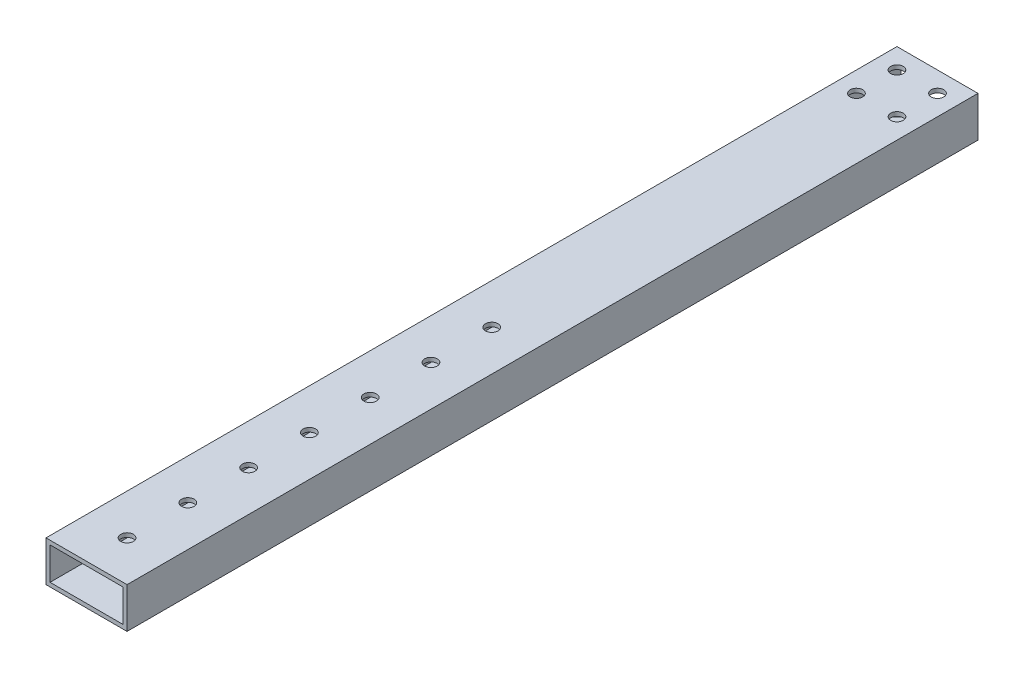
ISO-10303-21;
HEADER;
FILE_DESCRIPTION(('STEP AP214'),'2;1');
FILE_NAME('part.step','',(''),(''),'','','');
FILE_SCHEMA(('AUTOMOTIVE_DESIGN { 1 0 10303 214 1 1 1 1 }'));
ENDSEC;
DATA;
#1=APPLICATION_CONTEXT('core data for automotive mechanical design processes');
#2=APPLICATION_PROTOCOL_DEFINITION('international standard','automotive_design',2000,#1);
#3=PRODUCT_CONTEXT('',#1,'mechanical');
#4=PRODUCT('Part','Part','',(#3));
#5=PRODUCT_RELATED_PRODUCT_CATEGORY('part','',(#4));
#6=PRODUCT_DEFINITION_FORMATION('','',#4);
#7=PRODUCT_DEFINITION_CONTEXT('part definition',#1,'design');
#8=PRODUCT_DEFINITION('design','',#6,#7);
#9=PRODUCT_DEFINITION_SHAPE('','',#8);
#10=(LENGTH_UNIT() NAMED_UNIT(*) SI_UNIT(.MILLI.,.METRE.));
#11=(NAMED_UNIT(*) PLANE_ANGLE_UNIT() SI_UNIT($,.RADIAN.));
#12=(NAMED_UNIT(*) SI_UNIT($,.STERADIAN.) SOLID_ANGLE_UNIT());
#13=UNCERTAINTY_MEASURE_WITH_UNIT(LENGTH_MEASURE(1.E-05),#10,'distance_accuracy_value','');
#14=(GEOMETRIC_REPRESENTATION_CONTEXT(3) GLOBAL_UNCERTAINTY_ASSIGNED_CONTEXT((#13)) GLOBAL_UNIT_ASSIGNED_CONTEXT((#10,
#11,#12)) REPRESENTATION_CONTEXT('',''));
#15=CARTESIAN_POINT('',(0.,0.,0.));
#16=DIRECTION('',(0.,0.,1.));
#17=DIRECTION('',(1.,0.,0.));
#18=AXIS2_PLACEMENT_3D('',#15,#16,#17);
#19=CARTESIAN_POINT('',(0.,0.,210.));
#20=DIRECTION('',(0.,0.,-1.));
#21=DIRECTION('',(-1.,0.,0.));
#22=AXIS2_PLACEMENT_3D('',#19,#20,#21);
#23=PLANE('',#22);
#24=DIRECTION('',(0.,-1.,0.));
#25=VECTOR('',#24,1.);
#26=CARTESIAN_POINT('',(0.,0.,210.));
#27=LINE('',#26,#25);
#28=CARTESIAN_POINT('',(0.,10.,210.));
#29=VERTEX_POINT('',#28);
#30=CARTESIAN_POINT('',(0.,0.,210.));
#31=VERTEX_POINT('',#30);
#32=EDGE_CURVE('E165',#29,#31,#27,.T.);
#33=ORIENTED_EDGE('',*,*,#32,.T.);
#34=DIRECTION('',(1.,0.,0.));
#35=VECTOR('',#34,1.);
#36=CARTESIAN_POINT('',(0.,0.,210.));
#37=LINE('',#36,#35);
#38=CARTESIAN_POINT('',(20.,0.,210.));
#39=VERTEX_POINT('',#38);
#40=EDGE_CURVE('E169',#31,#39,#37,.T.);
#41=ORIENTED_EDGE('',*,*,#40,.T.);
#42=DIRECTION('',(0.,1.,0.));
#43=VECTOR('',#42,1.);
#44=CARTESIAN_POINT('',(20.,0.,210.));
#45=LINE('',#44,#43);
#46=CARTESIAN_POINT('',(20.,10.,210.));
#47=VERTEX_POINT('',#46);
#48=EDGE_CURVE('E172',#39,#47,#45,.T.);
#49=ORIENTED_EDGE('',*,*,#48,.T.);
#50=DIRECTION('',(-1.,0.,0.));
#51=VECTOR('',#50,1.);
#52=CARTESIAN_POINT('',(0.,10.,210.));
#53=LINE('',#52,#51);
#54=EDGE_CURVE('E175',#47,#29,#53,.T.);
#55=ORIENTED_EDGE('',*,*,#54,.T.);
#56=EDGE_LOOP('',(#33,#41,#49,#55));
#57=FACE_BOUND('',#56,.T.);
#58=DIRECTION('',(1.,0.,0.));
#59=VECTOR('',#58,1.);
#60=CARTESIAN_POINT('',(1.,1.,210.));
#61=LINE('',#60,#59);
#62=CARTESIAN_POINT('',(1.,1.,210.));
#63=VERTEX_POINT('',#62);
#64=CARTESIAN_POINT('',(19.,1.,210.));
#65=VERTEX_POINT('',#64);
#66=EDGE_CURVE('E113',#63,#65,#61,.T.);
#67=ORIENTED_EDGE('',*,*,#66,.F.);
#68=DIRECTION('',(0.,-1.,0.));
#69=VECTOR('',#68,1.);
#70=CARTESIAN_POINT('',(1.,1.,210.));
#71=LINE('',#70,#69);
#72=CARTESIAN_POINT('',(1.,9.,210.));
#73=VERTEX_POINT('',#72);
#74=EDGE_CURVE('E141',#73,#63,#71,.T.);
#75=ORIENTED_EDGE('',*,*,#74,.F.);
#76=DIRECTION('',(-1.,0.,0.));
#77=VECTOR('',#76,1.);
#78=CARTESIAN_POINT('',(1.,9.,210.));
#79=LINE('',#78,#77);
#80=CARTESIAN_POINT('',(19.,9.,210.));
#81=VERTEX_POINT('',#80);
#82=EDGE_CURVE('E135',#81,#73,#79,.T.);
#83=ORIENTED_EDGE('',*,*,#82,.F.);
#84=DIRECTION('',(0.,1.,0.));
#85=VECTOR('',#84,1.);
#86=CARTESIAN_POINT('',(19.,1.,210.));
#87=LINE('',#86,#85);
#88=EDGE_CURVE('E122',#65,#81,#87,.T.);
#89=ORIENTED_EDGE('',*,*,#88,.F.);
#90=EDGE_LOOP('',(#67,#75,#83,#89));
#91=FACE_BOUND('',#90,.T.);
#92=ADVANCED_FACE('F45',(#57,#91),#23,.F.);
#93=CARTESIAN_POINT('',(0.,0.,0.));
#94=DIRECTION('',(0.,0.,-1.));
#95=DIRECTION('',(-1.,0.,0.));
#96=AXIS2_PLACEMENT_3D('',#93,#94,#95);
#97=PLANE('',#96);
#98=DIRECTION('',(0.,-1.,0.));
#99=VECTOR('',#98,1.);
#100=CARTESIAN_POINT('',(0.,0.,0.));
#101=LINE('',#100,#99);
#102=CARTESIAN_POINT('',(0.,10.,0.));
#103=VERTEX_POINT('',#102);
#104=CARTESIAN_POINT('',(0.,0.,0.));
#105=VERTEX_POINT('',#104);
#106=EDGE_CURVE('E131',#103,#105,#101,.T.);
#107=ORIENTED_EDGE('',*,*,#106,.F.);
#108=DIRECTION('',(-1.,0.,0.));
#109=VECTOR('',#108,1.);
#110=CARTESIAN_POINT('',(0.,10.,0.));
#111=LINE('',#110,#109);
#112=CARTESIAN_POINT('',(20.,10.,0.));
#113=VERTEX_POINT('',#112);
#114=EDGE_CURVE('E170',#113,#103,#111,.T.);
#115=ORIENTED_EDGE('',*,*,#114,.F.);
#116=DIRECTION('',(0.,1.,0.));
#117=VECTOR('',#116,1.);
#118=CARTESIAN_POINT('',(20.,0.,0.));
#119=LINE('',#118,#117);
#120=CARTESIAN_POINT('',(20.,0.,0.));
#121=VERTEX_POINT('',#120);
#122=EDGE_CURVE('E185',#121,#113,#119,.T.);
#123=ORIENTED_EDGE('',*,*,#122,.F.);
#124=DIRECTION('',(1.,0.,0.));
#125=VECTOR('',#124,1.);
#126=CARTESIAN_POINT('',(0.,0.,0.));
#127=LINE('',#126,#125);
#128=EDGE_CURVE('E182',#105,#121,#127,.T.);
#129=ORIENTED_EDGE('',*,*,#128,.F.);
#130=EDGE_LOOP('',(#107,#115,#123,#129));
#131=FACE_BOUND('',#130,.T.);
#132=DIRECTION('',(0.,-1.,0.));
#133=VECTOR('',#132,1.);
#134=CARTESIAN_POINT('',(1.,1.,0.));
#135=LINE('',#134,#133);
#136=CARTESIAN_POINT('',(1.,9.,0.));
#137=VERTEX_POINT('',#136);
#138=CARTESIAN_POINT('',(1.,1.,0.));
#139=VERTEX_POINT('',#138);
#140=EDGE_CURVE('E123',#137,#139,#135,.T.);
#141=ORIENTED_EDGE('',*,*,#140,.T.);
#142=DIRECTION('',(1.,0.,0.));
#143=VECTOR('',#142,1.);
#144=CARTESIAN_POINT('',(1.,1.,0.));
#145=LINE('',#144,#143);
#146=CARTESIAN_POINT('',(19.,1.,0.));
#147=VERTEX_POINT('',#146);
#148=EDGE_CURVE('E71',#139,#147,#145,.T.);
#149=ORIENTED_EDGE('',*,*,#148,.T.);
#150=DIRECTION('',(0.,1.,0.));
#151=VECTOR('',#150,1.);
#152=CARTESIAN_POINT('',(19.,1.,0.));
#153=LINE('',#152,#151);
#154=CARTESIAN_POINT('',(19.,9.,0.));
#155=VERTEX_POINT('',#154);
#156=EDGE_CURVE('E129',#147,#155,#153,.T.);
#157=ORIENTED_EDGE('',*,*,#156,.T.);
#158=DIRECTION('',(-1.,0.,0.));
#159=VECTOR('',#158,1.);
#160=CARTESIAN_POINT('',(1.,9.,0.));
#161=LINE('',#160,#159);
#162=EDGE_CURVE('E152',#155,#137,#161,.T.);
#163=ORIENTED_EDGE('',*,*,#162,.T.);
#164=EDGE_LOOP('',(#141,#149,#157,#163));
#165=FACE_BOUND('',#164,.T.);
#166=ADVANCED_FACE('F346',(#131,#165),#97,.T.);
#167=CARTESIAN_POINT('',(0.,0.,210.));
#168=DIRECTION('',(1.,0.,0.));
#169=DIRECTION('',(0.,0.,-1.));
#170=AXIS2_PLACEMENT_3D('',#167,#168,#169);
#171=PLANE('',#170);
#172=ORIENTED_EDGE('',*,*,#106,.T.);
#173=DIRECTION('',(0.,0.,-1.));
#174=VECTOR('',#173,1.);
#175=CARTESIAN_POINT('',(0.,0.,210.));
#176=LINE('',#175,#174);
#177=EDGE_CURVE('E11',#31,#105,#176,.T.);
#178=ORIENTED_EDGE('',*,*,#177,.F.);
#179=ORIENTED_EDGE('',*,*,#32,.F.);
#180=DIRECTION('',(0.,0.,-1.));
#181=VECTOR('',#180,1.);
#182=CARTESIAN_POINT('',(0.,10.,210.));
#183=LINE('',#182,#181);
#184=EDGE_CURVE('E178',#29,#103,#183,.T.);
#185=ORIENTED_EDGE('',*,*,#184,.T.);
#186=EDGE_LOOP('',(#172,#178,#179,#185));
#187=FACE_BOUND('',#186,.T.);
#188=ADVANCED_FACE('F47',(#187),#171,.F.);
#189=CARTESIAN_POINT('',(0.,0.,210.));
#190=DIRECTION('',(0.,1.,0.));
#191=DIRECTION('',(0.,0.,1.));
#192=AXIS2_PLACEMENT_3D('',#189,#190,#191);
#193=PLANE('',#192);
#194=CARTESIAN_POINT('',(10.,0.,200.));
#195=DIRECTION('',(0.,-1.,0.));
#196=DIRECTION('',(0.,0.,-1.));
#197=AXIS2_PLACEMENT_3D('',#194,#195,#196);
#198=CIRCLE('',#197,1.55);
#199=CARTESIAN_POINT('',(10.,0.,198.45));
#200=VERTEX_POINT('',#199);
#201=EDGE_CURVE('E667',#200,#200,#198,.T.);
#202=ORIENTED_EDGE('',*,*,#201,.F.);
#203=EDGE_LOOP('',(#202));
#204=FACE_BOUND('',#203,.T.);
#205=CARTESIAN_POINT('',(10.0000000000002,0.,185.));
#206=DIRECTION('',(0.,-1.,0.));
#207=DIRECTION('',(0.,0.,-1.));
#208=AXIS2_PLACEMENT_3D('',#205,#206,#207);
#209=CIRCLE('',#208,1.55);
#210=CARTESIAN_POINT('',(10.0000000000002,0.,183.45));
#211=VERTEX_POINT('',#210);
#212=EDGE_CURVE('E669',#211,#211,#209,.T.);
#213=ORIENTED_EDGE('',*,*,#212,.F.);
#214=EDGE_LOOP('',(#213));
#215=FACE_BOUND('',#214,.T.);
#216=CARTESIAN_POINT('',(10.0000000000003,0.,170.));
#217=DIRECTION('',(0.,-1.,0.));
#218=DIRECTION('',(0.,0.,-1.));
#219=AXIS2_PLACEMENT_3D('',#216,#217,#218);
#220=CIRCLE('',#219,1.55);
#221=CARTESIAN_POINT('',(10.0000000000003,0.,168.45));
#222=VERTEX_POINT('',#221);
#223=EDGE_CURVE('E682',#222,#222,#220,.T.);
#224=ORIENTED_EDGE('',*,*,#223,.F.);
#225=EDGE_LOOP('',(#224));
#226=FACE_BOUND('',#225,.T.);
#227=CARTESIAN_POINT('',(10.0000000000005,0.,155.));
#228=DIRECTION('',(0.,-1.,0.));
#229=DIRECTION('',(0.,0.,-1.));
#230=AXIS2_PLACEMENT_3D('',#227,#228,#229);
#231=CIRCLE('',#230,1.54999999999999);
#232=CARTESIAN_POINT('',(10.0000000000005,0.,153.45));
#233=VERTEX_POINT('',#232);
#234=EDGE_CURVE('E690',#233,#233,#231,.T.);
#235=ORIENTED_EDGE('',*,*,#234,.F.);
#236=EDGE_LOOP('',(#235));
#237=FACE_BOUND('',#236,.T.);
#238=CARTESIAN_POINT('',(10.0000000000006,0.,140.));
#239=DIRECTION('',(0.,-1.,0.));
#240=DIRECTION('',(0.,0.,-1.));
#241=AXIS2_PLACEMENT_3D('',#238,#239,#240);
#242=CIRCLE('',#241,1.55);
#243=CARTESIAN_POINT('',(10.0000000000006,0.,138.45));
#244=VERTEX_POINT('',#243);
#245=EDGE_CURVE('E698',#244,#244,#242,.T.);
#246=ORIENTED_EDGE('',*,*,#245,.F.);
#247=EDGE_LOOP('',(#246));
#248=FACE_BOUND('',#247,.T.);
#249=CARTESIAN_POINT('',(10.0000000000018,0.,125.));
#250=DIRECTION('',(0.,-1.,0.));
#251=DIRECTION('',(0.,0.,-1.));
#252=AXIS2_PLACEMENT_3D('',#249,#250,#251);
#253=CIRCLE('',#252,1.55);
#254=CARTESIAN_POINT('',(10.0000000000018,0.,123.45));
#255=VERTEX_POINT('',#254);
#256=EDGE_CURVE('E706',#255,#255,#253,.T.);
#257=ORIENTED_EDGE('',*,*,#256,.F.);
#258=EDGE_LOOP('',(#257));
#259=FACE_BOUND('',#258,.T.);
#260=CARTESIAN_POINT('',(10.0000000000022,0.,110.));
#261=DIRECTION('',(0.,-1.,0.));
#262=DIRECTION('',(0.,0.,-1.));
#263=AXIS2_PLACEMENT_3D('',#260,#261,#262);
#264=CIRCLE('',#263,1.55);
#265=CARTESIAN_POINT('',(10.0000000000022,0.,108.45));
#266=VERTEX_POINT('',#265);
#267=EDGE_CURVE('E713',#266,#266,#264,.T.);
#268=ORIENTED_EDGE('',*,*,#267,.F.);
#269=EDGE_LOOP('',(#268));
#270=FACE_BOUND('',#269,.T.);
#271=CARTESIAN_POINT('',(4.99999999999997,0.,15.));
#272=DIRECTION('',(0.,-1.,0.));
#273=DIRECTION('',(0.,0.,-1.));
#274=AXIS2_PLACEMENT_3D('',#271,#272,#273);
#275=CIRCLE('',#274,1.55);
#276=CARTESIAN_POINT('',(4.99999999999997,0.,13.45));
#277=VERTEX_POINT('',#276);
#278=EDGE_CURVE('E284',#277,#277,#275,.T.);
#279=ORIENTED_EDGE('',*,*,#278,.F.);
#280=EDGE_LOOP('',(#279));
#281=FACE_BOUND('',#280,.T.);
#282=CARTESIAN_POINT('',(15.,0.,15.0000000000001));
#283=DIRECTION('',(0.,-1.,0.));
#284=DIRECTION('',(0.,0.,-1.));
#285=AXIS2_PLACEMENT_3D('',#282,#283,#284);
#286=CIRCLE('',#285,1.55);
#287=CARTESIAN_POINT('',(15.,0.,13.4500000000001));
#288=VERTEX_POINT('',#287);
#289=EDGE_CURVE('E276',#288,#288,#286,.T.);
#290=ORIENTED_EDGE('',*,*,#289,.F.);
#291=EDGE_LOOP('',(#290));
#292=FACE_BOUND('',#291,.T.);
#293=CARTESIAN_POINT('',(15.,0.,5.00000000000014));
#294=DIRECTION('',(0.,-1.,0.));
#295=DIRECTION('',(0.,0.,-1.));
#296=AXIS2_PLACEMENT_3D('',#293,#294,#295);
#297=CIRCLE('',#296,1.55);
#298=CARTESIAN_POINT('',(15.,0.,3.45000000000014));
#299=VERTEX_POINT('',#298);
#300=EDGE_CURVE('E268',#299,#299,#297,.T.);
#301=ORIENTED_EDGE('',*,*,#300,.F.);
#302=EDGE_LOOP('',(#301));
#303=FACE_BOUND('',#302,.T.);
#304=CARTESIAN_POINT('',(5.,0.,5.));
#305=DIRECTION('',(0.,-1.,0.));
#306=DIRECTION('',(0.,0.,-1.));
#307=AXIS2_PLACEMENT_3D('',#304,#305,#306);
#308=CIRCLE('',#307,1.55);
#309=CARTESIAN_POINT('',(5.,0.,3.45));
#310=VERTEX_POINT('',#309);
#311=EDGE_CURVE('E272',#310,#310,#308,.T.);
#312=ORIENTED_EDGE('',*,*,#311,.F.);
#313=EDGE_LOOP('',(#312));
#314=FACE_BOUND('',#313,.T.);
#315=ORIENTED_EDGE('',*,*,#128,.T.);
#316=DIRECTION('',(0.,0.,-1.));
#317=VECTOR('',#316,1.);
#318=CARTESIAN_POINT('',(20.,0.,210.));
#319=LINE('',#318,#317);
#320=EDGE_CURVE('E55',#39,#121,#319,.T.);
#321=ORIENTED_EDGE('',*,*,#320,.F.);
#322=ORIENTED_EDGE('',*,*,#40,.F.);
#323=ORIENTED_EDGE('',*,*,#177,.T.);
#324=EDGE_LOOP('',(#315,#321,#322,#323));
#325=FACE_BOUND('',#324,.T.);
#326=ADVANCED_FACE('F332',(#204,#215,#226,#237,#248,#259,#270,#281,#292,#303,#314,#325),#193,.F.);
#327=CARTESIAN_POINT('',(20.,0.,210.));
#328=DIRECTION('',(-1.,0.,0.));
#329=DIRECTION('',(0.,0.,1.));
#330=AXIS2_PLACEMENT_3D('',#327,#328,#329);
#331=PLANE('',#330);
#332=ORIENTED_EDGE('',*,*,#122,.T.);
#333=DIRECTION('',(0.,0.,-1.));
#334=VECTOR('',#333,1.);
#335=CARTESIAN_POINT('',(20.,10.,210.));
#336=LINE('',#335,#334);
#337=EDGE_CURVE('E193',#47,#113,#336,.T.);
#338=ORIENTED_EDGE('',*,*,#337,.F.);
#339=ORIENTED_EDGE('',*,*,#48,.F.);
#340=ORIENTED_EDGE('',*,*,#320,.T.);
#341=EDGE_LOOP('',(#332,#338,#339,#340));
#342=FACE_BOUND('',#341,.T.);
#343=ADVANCED_FACE('F335',(#342),#331,.F.);
#344=CARTESIAN_POINT('',(0.,10.,210.));
#345=DIRECTION('',(0.,-1.,0.));
#346=DIRECTION('',(0.,0.,-1.));
#347=AXIS2_PLACEMENT_3D('',#344,#345,#346);
#348=PLANE('',#347);
#349=CARTESIAN_POINT('',(10.,10.,200.));
#350=DIRECTION('',(0.,-1.,0.));
#351=DIRECTION('',(0.,0.,-1.));
#352=AXIS2_PLACEMENT_3D('',#349,#350,#351);
#353=CIRCLE('',#352,1.55);
#354=CARTESIAN_POINT('',(10.,10.,198.45));
#355=VERTEX_POINT('',#354);
#356=EDGE_CURVE('E225',#355,#355,#353,.T.);
#357=ORIENTED_EDGE('',*,*,#356,.T.);
#358=EDGE_LOOP('',(#357));
#359=FACE_BOUND('',#358,.T.);
#360=CARTESIAN_POINT('',(10.0000000000002,10.,185.));
#361=DIRECTION('',(0.,-1.,0.));
#362=DIRECTION('',(0.,0.,-1.));
#363=AXIS2_PLACEMENT_3D('',#360,#361,#362);
#364=CIRCLE('',#363,1.55);
#365=CARTESIAN_POINT('',(10.0000000000002,10.,183.45));
#366=VERTEX_POINT('',#365);
#367=EDGE_CURVE('E676',#366,#366,#364,.T.);
#368=ORIENTED_EDGE('',*,*,#367,.T.);
#369=EDGE_LOOP('',(#368));
#370=FACE_BOUND('',#369,.T.);
#371=CARTESIAN_POINT('',(10.0000000000003,10.,170.));
#372=DIRECTION('',(0.,-1.,0.));
#373=DIRECTION('',(0.,0.,-1.));
#374=AXIS2_PLACEMENT_3D('',#371,#372,#373);
#375=CIRCLE('',#374,1.55);
#376=CARTESIAN_POINT('',(10.0000000000003,10.,168.45));
#377=VERTEX_POINT('',#376);
#378=EDGE_CURVE('E686',#377,#377,#375,.T.);
#379=ORIENTED_EDGE('',*,*,#378,.T.);
#380=EDGE_LOOP('',(#379));
#381=FACE_BOUND('',#380,.T.);
#382=CARTESIAN_POINT('',(10.0000000000005,10.,155.));
#383=DIRECTION('',(0.,-1.,0.));
#384=DIRECTION('',(0.,0.,-1.));
#385=AXIS2_PLACEMENT_3D('',#382,#383,#384);
#386=CIRCLE('',#385,1.54999999999999);
#387=CARTESIAN_POINT('',(10.0000000000005,10.,153.45));
#388=VERTEX_POINT('',#387);
#389=EDGE_CURVE('E694',#388,#388,#386,.T.);
#390=ORIENTED_EDGE('',*,*,#389,.T.);
#391=EDGE_LOOP('',(#390));
#392=FACE_BOUND('',#391,.T.);
#393=CARTESIAN_POINT('',(10.0000000000006,10.,140.));
#394=DIRECTION('',(0.,-1.,0.));
#395=DIRECTION('',(0.,0.,-1.));
#396=AXIS2_PLACEMENT_3D('',#393,#394,#395);
#397=CIRCLE('',#396,1.55);
#398=CARTESIAN_POINT('',(10.0000000000006,10.,138.45));
#399=VERTEX_POINT('',#398);
#400=EDGE_CURVE('E702',#399,#399,#397,.T.);
#401=ORIENTED_EDGE('',*,*,#400,.T.);
#402=EDGE_LOOP('',(#401));
#403=FACE_BOUND('',#402,.T.);
#404=CARTESIAN_POINT('',(10.0000000000018,10.,125.));
#405=DIRECTION('',(0.,-1.,0.));
#406=DIRECTION('',(0.,0.,-1.));
#407=AXIS2_PLACEMENT_3D('',#404,#405,#406);
#408=CIRCLE('',#407,1.55);
#409=CARTESIAN_POINT('',(10.0000000000018,10.,123.45));
#410=VERTEX_POINT('',#409);
#411=EDGE_CURVE('E710',#410,#410,#408,.T.);
#412=ORIENTED_EDGE('',*,*,#411,.T.);
#413=EDGE_LOOP('',(#412));
#414=FACE_BOUND('',#413,.T.);
#415=CARTESIAN_POINT('',(10.0000000000022,10.,110.));
#416=DIRECTION('',(0.,-1.,0.));
#417=DIRECTION('',(0.,0.,-1.));
#418=AXIS2_PLACEMENT_3D('',#415,#416,#417);
#419=CIRCLE('',#418,1.55);
#420=CARTESIAN_POINT('',(10.0000000000022,10.,108.45));
#421=VERTEX_POINT('',#420);
#422=EDGE_CURVE('E717',#421,#421,#419,.T.);
#423=ORIENTED_EDGE('',*,*,#422,.T.);
#424=EDGE_LOOP('',(#423));
#425=FACE_BOUND('',#424,.T.);
#426=CARTESIAN_POINT('',(4.99999999999997,10.,15.));
#427=DIRECTION('',(0.,-1.,0.));
#428=DIRECTION('',(0.,0.,-1.));
#429=AXIS2_PLACEMENT_3D('',#426,#427,#428);
#430=CIRCLE('',#429,1.55);
#431=CARTESIAN_POINT('',(4.99999999999997,10.,13.45));
#432=VERTEX_POINT('',#431);
#433=EDGE_CURVE('E267',#432,#432,#430,.T.);
#434=ORIENTED_EDGE('',*,*,#433,.T.);
#435=EDGE_LOOP('',(#434));
#436=FACE_BOUND('',#435,.T.);
#437=CARTESIAN_POINT('',(15.,10.,15.0000000000001));
#438=DIRECTION('',(0.,-1.,0.));
#439=DIRECTION('',(0.,0.,-1.));
#440=AXIS2_PLACEMENT_3D('',#437,#438,#439);
#441=CIRCLE('',#440,1.55);
#442=CARTESIAN_POINT('',(15.,10.,13.4500000000001));
#443=VERTEX_POINT('',#442);
#444=EDGE_CURVE('E280',#443,#443,#441,.T.);
#445=ORIENTED_EDGE('',*,*,#444,.T.);
#446=EDGE_LOOP('',(#445));
#447=FACE_BOUND('',#446,.T.);
#448=CARTESIAN_POINT('',(15.,10.,5.00000000000014));
#449=DIRECTION('',(0.,-1.,0.));
#450=DIRECTION('',(0.,0.,-1.));
#451=AXIS2_PLACEMENT_3D('',#448,#449,#450);
#452=CIRCLE('',#451,1.55);
#453=CARTESIAN_POINT('',(15.,10.,3.45000000000014));
#454=VERTEX_POINT('',#453);
#455=EDGE_CURVE('E273',#454,#454,#452,.T.);
#456=ORIENTED_EDGE('',*,*,#455,.T.);
#457=EDGE_LOOP('',(#456));
#458=FACE_BOUND('',#457,.T.);
#459=CARTESIAN_POINT('',(5.,10.,5.));
#460=DIRECTION('',(0.,-1.,0.));
#461=DIRECTION('',(0.,0.,-1.));
#462=AXIS2_PLACEMENT_3D('',#459,#460,#461);
#463=CIRCLE('',#462,1.55);
#464=CARTESIAN_POINT('',(5.,10.,3.45));
#465=VERTEX_POINT('',#464);
#466=EDGE_CURVE('E205',#465,#465,#463,.T.);
#467=ORIENTED_EDGE('',*,*,#466,.T.);
#468=EDGE_LOOP('',(#467));
#469=FACE_BOUND('',#468,.T.);
#470=ORIENTED_EDGE('',*,*,#114,.T.);
#471=ORIENTED_EDGE('',*,*,#184,.F.);
#472=ORIENTED_EDGE('',*,*,#54,.F.);
#473=ORIENTED_EDGE('',*,*,#337,.T.);
#474=EDGE_LOOP('',(#470,#471,#472,#473));
#475=FACE_BOUND('',#474,.T.);
#476=ADVANCED_FACE('F314',(#359,#370,#381,#392,#403,#414,#425,#436,#447,#458,#469,#475),#348,.F.);
#477=CARTESIAN_POINT('',(1.,1.,210.));
#478=DIRECTION('',(0.,1.,0.));
#479=DIRECTION('',(0.,0.,1.));
#480=AXIS2_PLACEMENT_3D('',#477,#478,#479);
#481=PLANE('',#480);
#482=CARTESIAN_POINT('',(10.,0.999999999999999,200.));
#483=DIRECTION('',(0.,1.,0.));
#484=DIRECTION('',(0.,0.,1.));
#485=AXIS2_PLACEMENT_3D('',#482,#483,#484);
#486=CIRCLE('',#485,1.55);
#487=CARTESIAN_POINT('',(10.,0.999999999999999,201.55));
#488=VERTEX_POINT('',#487);
#489=EDGE_CURVE('E263',#488,#488,#486,.T.);
#490=ORIENTED_EDGE('',*,*,#489,.F.);
#491=EDGE_LOOP('',(#490));
#492=FACE_BOUND('',#491,.T.);
#493=CARTESIAN_POINT('',(10.0000000000002,0.999999999999999,185.));
#494=DIRECTION('',(0.,1.,0.));
#495=DIRECTION('',(0.,0.,1.));
#496=AXIS2_PLACEMENT_3D('',#493,#494,#495);
#497=CIRCLE('',#496,1.55);
#498=CARTESIAN_POINT('',(10.0000000000002,0.999999999999999,186.55));
#499=VERTEX_POINT('',#498);
#500=EDGE_CURVE('E248',#499,#499,#497,.T.);
#501=ORIENTED_EDGE('',*,*,#500,.F.);
#502=EDGE_LOOP('',(#501));
#503=FACE_BOUND('',#502,.T.);
#504=CARTESIAN_POINT('',(10.0000000000003,0.999999999999999,170.));
#505=DIRECTION('',(0.,1.,0.));
#506=DIRECTION('',(0.,0.,1.));
#507=AXIS2_PLACEMENT_3D('',#504,#505,#506);
#508=CIRCLE('',#507,1.55);
#509=CARTESIAN_POINT('',(10.0000000000003,0.999999999999999,171.55));
#510=VERTEX_POINT('',#509);
#511=EDGE_CURVE('E244',#510,#510,#508,.T.);
#512=ORIENTED_EDGE('',*,*,#511,.F.);
#513=EDGE_LOOP('',(#512));
#514=FACE_BOUND('',#513,.T.);
#515=CARTESIAN_POINT('',(10.0000000000005,0.999999999999999,155.));
#516=DIRECTION('',(0.,1.,0.));
#517=DIRECTION('',(0.,0.,1.));
#518=AXIS2_PLACEMENT_3D('',#515,#516,#517);
#519=CIRCLE('',#518,1.54999999999999);
#520=CARTESIAN_POINT('',(10.0000000000005,0.999999999999999,156.55));
#521=VERTEX_POINT('',#520);
#522=EDGE_CURVE('E240',#521,#521,#519,.T.);
#523=ORIENTED_EDGE('',*,*,#522,.F.);
#524=EDGE_LOOP('',(#523));
#525=FACE_BOUND('',#524,.T.);
#526=CARTESIAN_POINT('',(10.0000000000006,0.999999999999999,140.));
#527=DIRECTION('',(0.,1.,0.));
#528=DIRECTION('',(0.,0.,1.));
#529=AXIS2_PLACEMENT_3D('',#526,#527,#528);
#530=CIRCLE('',#529,1.55);
#531=CARTESIAN_POINT('',(10.0000000000006,0.999999999999999,141.55));
#532=VERTEX_POINT('',#531);
#533=EDGE_CURVE('E235',#532,#532,#530,.T.);
#534=ORIENTED_EDGE('',*,*,#533,.F.);
#535=EDGE_LOOP('',(#534));
#536=FACE_BOUND('',#535,.T.);
#537=CARTESIAN_POINT('',(10.0000000000018,0.999999999999999,125.));
#538=DIRECTION('',(0.,1.,0.));
#539=DIRECTION('',(0.,0.,1.));
#540=AXIS2_PLACEMENT_3D('',#537,#538,#539);
#541=CIRCLE('',#540,1.55);
#542=CARTESIAN_POINT('',(10.0000000000018,0.999999999999999,126.55));
#543=VERTEX_POINT('',#542);
#544=EDGE_CURVE('E230',#543,#543,#541,.T.);
#545=ORIENTED_EDGE('',*,*,#544,.F.);
#546=EDGE_LOOP('',(#545));
#547=FACE_BOUND('',#546,.T.);
#548=CARTESIAN_POINT('',(10.0000000000022,0.999999999999999,110.));
#549=DIRECTION('',(0.,1.,0.));
#550=DIRECTION('',(0.,0.,1.));
#551=AXIS2_PLACEMENT_3D('',#548,#549,#550);
#552=CIRCLE('',#551,1.55);
#553=CARTESIAN_POINT('',(10.0000000000022,0.999999999999999,111.55));
#554=VERTEX_POINT('',#553);
#555=EDGE_CURVE('E224',#554,#554,#552,.T.);
#556=ORIENTED_EDGE('',*,*,#555,.F.);
#557=EDGE_LOOP('',(#556));
#558=FACE_BOUND('',#557,.T.);
#559=CARTESIAN_POINT('',(4.99999999999997,0.999999999999999,15.));
#560=DIRECTION('',(0.,1.,0.));
#561=DIRECTION('',(0.,0.,1.));
#562=AXIS2_PLACEMENT_3D('',#559,#560,#561);
#563=CIRCLE('',#562,1.55);
#564=CARTESIAN_POINT('',(4.99999999999997,0.999999999999999,16.55));
#565=VERTEX_POINT('',#564);
#566=EDGE_CURVE('E149',#565,#565,#563,.T.);
#567=ORIENTED_EDGE('',*,*,#566,.F.);
#568=EDGE_LOOP('',(#567));
#569=FACE_BOUND('',#568,.T.);
#570=CARTESIAN_POINT('',(15.,0.999999999999999,15.0000000000001));
#571=DIRECTION('',(0.,1.,0.));
#572=DIRECTION('',(0.,0.,1.));
#573=AXIS2_PLACEMENT_3D('',#570,#571,#572);
#574=CIRCLE('',#573,1.55);
#575=CARTESIAN_POINT('',(15.,0.999999999999999,16.5500000000001));
#576=VERTEX_POINT('',#575);
#577=EDGE_CURVE('E215',#576,#576,#574,.T.);
#578=ORIENTED_EDGE('',*,*,#577,.F.);
#579=EDGE_LOOP('',(#578));
#580=FACE_BOUND('',#579,.T.);
#581=CARTESIAN_POINT('',(15.,0.999999999999999,5.00000000000014));
#582=DIRECTION('',(0.,1.,0.));
#583=DIRECTION('',(0.,0.,1.));
#584=AXIS2_PLACEMENT_3D('',#581,#582,#583);
#585=CIRCLE('',#584,1.55);
#586=CARTESIAN_POINT('',(15.,0.999999999999999,6.55000000000015));
#587=VERTEX_POINT('',#586);
#588=EDGE_CURVE('E210',#587,#587,#585,.T.);
#589=ORIENTED_EDGE('',*,*,#588,.F.);
#590=EDGE_LOOP('',(#589));
#591=FACE_BOUND('',#590,.T.);
#592=CARTESIAN_POINT('',(5.,0.999999999999999,5.));
#593=DIRECTION('',(0.,1.,0.));
#594=DIRECTION('',(0.,0.,1.));
#595=AXIS2_PLACEMENT_3D('',#592,#593,#594);
#596=CIRCLE('',#595,1.55);
#597=CARTESIAN_POINT('',(5.,0.999999999999999,6.55));
#598=VERTEX_POINT('',#597);
#599=EDGE_CURVE('E204',#598,#598,#596,.T.);
#600=ORIENTED_EDGE('',*,*,#599,.F.);
#601=EDGE_LOOP('',(#600));
#602=FACE_BOUND('',#601,.T.);
#603=ORIENTED_EDGE('',*,*,#148,.F.);
#604=DIRECTION('',(0.,0.,-1.));
#605=VECTOR('',#604,1.);
#606=CARTESIAN_POINT('',(1.,1.,210.));
#607=LINE('',#606,#605);
#608=EDGE_CURVE('E117',#63,#139,#607,.T.);
#609=ORIENTED_EDGE('',*,*,#608,.F.);
#610=ORIENTED_EDGE('',*,*,#66,.T.);
#611=DIRECTION('',(0.,0.,-1.));
#612=VECTOR('',#611,1.);
#613=CARTESIAN_POINT('',(19.,1.,210.));
#614=LINE('',#613,#612);
#615=EDGE_CURVE('E116',#65,#147,#614,.T.);
#616=ORIENTED_EDGE('',*,*,#615,.T.);
#617=EDGE_LOOP('',(#603,#609,#610,#616));
#618=FACE_BOUND('',#617,.T.);
#619=ADVANCED_FACE('F115',(#492,#503,#514,#525,#536,#547,#558,#569,#580,#591,#602,#618),#481,.T.);
#620=CARTESIAN_POINT('',(19.,1.,210.));
#621=DIRECTION('',(-1.,0.,0.));
#622=DIRECTION('',(0.,0.,1.));
#623=AXIS2_PLACEMENT_3D('',#620,#621,#622);
#624=PLANE('',#623);
#625=ORIENTED_EDGE('',*,*,#156,.F.);
#626=ORIENTED_EDGE('',*,*,#615,.F.);
#627=ORIENTED_EDGE('',*,*,#88,.T.);
#628=DIRECTION('',(0.,0.,-1.));
#629=VECTOR('',#628,1.);
#630=CARTESIAN_POINT('',(19.,9.,210.));
#631=LINE('',#630,#629);
#632=EDGE_CURVE('E132',#81,#155,#631,.T.);
#633=ORIENTED_EDGE('',*,*,#632,.T.);
#634=EDGE_LOOP('',(#625,#626,#627,#633));
#635=FACE_BOUND('',#634,.T.);
#636=ADVANCED_FACE('F126',(#635),#624,.T.);
#637=CARTESIAN_POINT('',(1.,9.,210.));
#638=DIRECTION('',(0.,-1.,0.));
#639=DIRECTION('',(0.,0.,-1.));
#640=AXIS2_PLACEMENT_3D('',#637,#638,#639);
#641=PLANE('',#640);
#642=CARTESIAN_POINT('',(10.,9.,200.));
#643=DIRECTION('',(0.,-1.,0.));
#644=DIRECTION('',(0.,0.,-1.));
#645=AXIS2_PLACEMENT_3D('',#642,#643,#644);
#646=CIRCLE('',#645,1.55);
#647=CARTESIAN_POINT('',(10.,9.,198.45));
#648=VERTEX_POINT('',#647);
#649=EDGE_CURVE('E49',#648,#648,#646,.T.);
#650=ORIENTED_EDGE('',*,*,#649,.F.);
#651=EDGE_LOOP('',(#650));
#652=FACE_BOUND('',#651,.T.);
#653=CARTESIAN_POINT('',(10.0000000000002,9.,185.));
#654=DIRECTION('',(0.,-1.,0.));
#655=DIRECTION('',(0.,0.,-1.));
#656=AXIS2_PLACEMENT_3D('',#653,#654,#655);
#657=CIRCLE('',#656,1.55);
#658=CARTESIAN_POINT('',(10.0000000000002,9.,183.45));
#659=VERTEX_POINT('',#658);
#660=EDGE_CURVE('E245',#659,#659,#657,.T.);
#661=ORIENTED_EDGE('',*,*,#660,.F.);
#662=EDGE_LOOP('',(#661));
#663=FACE_BOUND('',#662,.T.);
#664=CARTESIAN_POINT('',(10.0000000000003,9.,170.));
#665=DIRECTION('',(0.,-1.,0.));
#666=DIRECTION('',(0.,0.,-1.));
#667=AXIS2_PLACEMENT_3D('',#664,#665,#666);
#668=CIRCLE('',#667,1.55);
#669=CARTESIAN_POINT('',(10.0000000000003,9.,168.45));
#670=VERTEX_POINT('',#669);
#671=EDGE_CURVE('E241',#670,#670,#668,.T.);
#672=ORIENTED_EDGE('',*,*,#671,.F.);
#673=EDGE_LOOP('',(#672));
#674=FACE_BOUND('',#673,.T.);
#675=CARTESIAN_POINT('',(10.0000000000005,9.,155.));
#676=DIRECTION('',(0.,-1.,0.));
#677=DIRECTION('',(0.,0.,-1.));
#678=AXIS2_PLACEMENT_3D('',#675,#676,#677);
#679=CIRCLE('',#678,1.54999999999999);
#680=CARTESIAN_POINT('',(10.0000000000005,9.,153.45));
#681=VERTEX_POINT('',#680);
#682=EDGE_CURVE('E236',#681,#681,#679,.T.);
#683=ORIENTED_EDGE('',*,*,#682,.F.);
#684=EDGE_LOOP('',(#683));
#685=FACE_BOUND('',#684,.T.);
#686=CARTESIAN_POINT('',(10.0000000000006,9.,140.));
#687=DIRECTION('',(0.,-1.,0.));
#688=DIRECTION('',(0.,0.,-1.));
#689=AXIS2_PLACEMENT_3D('',#686,#687,#688);
#690=CIRCLE('',#689,1.55);
#691=CARTESIAN_POINT('',(10.0000000000006,9.,138.45));
#692=VERTEX_POINT('',#691);
#693=EDGE_CURVE('E231',#692,#692,#690,.T.);
#694=ORIENTED_EDGE('',*,*,#693,.F.);
#695=EDGE_LOOP('',(#694));
#696=FACE_BOUND('',#695,.T.);
#697=CARTESIAN_POINT('',(10.0000000000018,9.,125.));
#698=DIRECTION('',(0.,-1.,0.));
#699=DIRECTION('',(0.,0.,-1.));
#700=AXIS2_PLACEMENT_3D('',#697,#698,#699);
#701=CIRCLE('',#700,1.55);
#702=CARTESIAN_POINT('',(10.0000000000018,9.,123.45));
#703=VERTEX_POINT('',#702);
#704=EDGE_CURVE('E226',#703,#703,#701,.T.);
#705=ORIENTED_EDGE('',*,*,#704,.F.);
#706=EDGE_LOOP('',(#705));
#707=FACE_BOUND('',#706,.T.);
#708=CARTESIAN_POINT('',(10.0000000000022,9.,110.));
#709=DIRECTION('',(0.,-1.,0.));
#710=DIRECTION('',(0.,0.,-1.));
#711=AXIS2_PLACEMENT_3D('',#708,#709,#710);
#712=CIRCLE('',#711,1.55);
#713=CARTESIAN_POINT('',(10.0000000000022,9.,108.45));
#714=VERTEX_POINT('',#713);
#715=EDGE_CURVE('E220',#714,#714,#712,.T.);
#716=ORIENTED_EDGE('',*,*,#715,.F.);
#717=EDGE_LOOP('',(#716));
#718=FACE_BOUND('',#717,.T.);
#719=CARTESIAN_POINT('',(4.99999999999997,9.,15.));
#720=DIRECTION('',(0.,-1.,0.));
#721=DIRECTION('',(0.,0.,-1.));
#722=AXIS2_PLACEMENT_3D('',#719,#720,#721);
#723=CIRCLE('',#722,1.55);
#724=CARTESIAN_POINT('',(4.99999999999997,9.,13.45));
#725=VERTEX_POINT('',#724);
#726=EDGE_CURVE('E216',#725,#725,#723,.T.);
#727=ORIENTED_EDGE('',*,*,#726,.F.);
#728=EDGE_LOOP('',(#727));
#729=FACE_BOUND('',#728,.T.);
#730=CARTESIAN_POINT('',(15.,9.,15.0000000000001));
#731=DIRECTION('',(0.,-1.,0.));
#732=DIRECTION('',(0.,0.,-1.));
#733=AXIS2_PLACEMENT_3D('',#730,#731,#732);
#734=CIRCLE('',#733,1.55);
#735=CARTESIAN_POINT('',(15.,9.,13.4500000000001));
#736=VERTEX_POINT('',#735);
#737=EDGE_CURVE('E211',#736,#736,#734,.T.);
#738=ORIENTED_EDGE('',*,*,#737,.F.);
#739=EDGE_LOOP('',(#738));
#740=FACE_BOUND('',#739,.T.);
#741=CARTESIAN_POINT('',(15.,9.,5.00000000000014));
#742=DIRECTION('',(0.,-1.,0.));
#743=DIRECTION('',(0.,0.,-1.));
#744=AXIS2_PLACEMENT_3D('',#741,#742,#743);
#745=CIRCLE('',#744,1.55);
#746=CARTESIAN_POINT('',(15.,9.,3.45000000000014));
#747=VERTEX_POINT('',#746);
#748=EDGE_CURVE('E206',#747,#747,#745,.T.);
#749=ORIENTED_EDGE('',*,*,#748,.F.);
#750=EDGE_LOOP('',(#749));
#751=FACE_BOUND('',#750,.T.);
#752=CARTESIAN_POINT('',(5.,9.,5.));
#753=DIRECTION('',(0.,-1.,0.));
#754=DIRECTION('',(0.,0.,-1.));
#755=AXIS2_PLACEMENT_3D('',#752,#753,#754);
#756=CIRCLE('',#755,1.55);
#757=CARTESIAN_POINT('',(5.,9.,3.45));
#758=VERTEX_POINT('',#757);
#759=EDGE_CURVE('E200',#758,#758,#756,.T.);
#760=ORIENTED_EDGE('',*,*,#759,.F.);
#761=EDGE_LOOP('',(#760));
#762=FACE_BOUND('',#761,.T.);
#763=ORIENTED_EDGE('',*,*,#162,.F.);
#764=ORIENTED_EDGE('',*,*,#632,.F.);
#765=ORIENTED_EDGE('',*,*,#82,.T.);
#766=DIRECTION('',(0.,0.,-1.));
#767=VECTOR('',#766,1.);
#768=CARTESIAN_POINT('',(1.,9.,210.));
#769=LINE('',#768,#767);
#770=EDGE_CURVE('E63',#73,#137,#769,.T.);
#771=ORIENTED_EDGE('',*,*,#770,.T.);
#772=EDGE_LOOP('',(#763,#764,#765,#771));
#773=FACE_BOUND('',#772,.T.);
#774=ADVANCED_FACE('F381',(#652,#663,#674,#685,#696,#707,#718,#729,#740,#751,#762,#773),#641,.T.);
#775=CARTESIAN_POINT('',(1.,1.,210.));
#776=DIRECTION('',(1.,0.,0.));
#777=DIRECTION('',(0.,0.,-1.));
#778=AXIS2_PLACEMENT_3D('',#775,#776,#777);
#779=PLANE('',#778);
#780=ORIENTED_EDGE('',*,*,#140,.F.);
#781=ORIENTED_EDGE('',*,*,#770,.F.);
#782=ORIENTED_EDGE('',*,*,#74,.T.);
#783=ORIENTED_EDGE('',*,*,#608,.T.);
#784=EDGE_LOOP('',(#780,#781,#782,#783));
#785=FACE_BOUND('',#784,.T.);
#786=ADVANCED_FACE('F386',(#785),#779,.T.);
#787=CARTESIAN_POINT('',(5.,10.,5.));
#788=DIRECTION('',(0.,-1.,0.));
#789=DIRECTION('',(0.,0.,-1.));
#790=AXIS2_PLACEMENT_3D('',#787,#788,#789);
#791=CYLINDRICAL_SURFACE('',#790,1.55);
#792=ORIENTED_EDGE('',*,*,#759,.T.);
#793=EDGE_LOOP('',(#792));
#794=FACE_BOUND('',#793,.T.);
#795=ORIENTED_EDGE('',*,*,#466,.F.);
#796=EDGE_LOOP('',(#795));
#797=FACE_BOUND('',#796,.T.);
#798=ADVANCED_FACE('F329',(#794,#797),#791,.F.);
#799=CARTESIAN_POINT('',(15.,10.,5.00000000000014));
#800=DIRECTION('',(0.,-1.,0.));
#801=DIRECTION('',(0.,0.,-1.));
#802=AXIS2_PLACEMENT_3D('',#799,#800,#801);
#803=CYLINDRICAL_SURFACE('',#802,1.55);
#804=ORIENTED_EDGE('',*,*,#748,.T.);
#805=EDGE_LOOP('',(#804));
#806=FACE_BOUND('',#805,.T.);
#807=ORIENTED_EDGE('',*,*,#455,.F.);
#808=EDGE_LOOP('',(#807));
#809=FACE_BOUND('',#808,.T.);
#810=ADVANCED_FACE('F398',(#806,#809),#803,.F.);
#811=CARTESIAN_POINT('',(15.,10.,15.0000000000001));
#812=DIRECTION('',(0.,-1.,0.));
#813=DIRECTION('',(0.,0.,-1.));
#814=AXIS2_PLACEMENT_3D('',#811,#812,#813);
#815=CYLINDRICAL_SURFACE('',#814,1.55);
#816=ORIENTED_EDGE('',*,*,#737,.T.);
#817=EDGE_LOOP('',(#816));
#818=FACE_BOUND('',#817,.T.);
#819=ORIENTED_EDGE('',*,*,#444,.F.);
#820=EDGE_LOOP('',(#819));
#821=FACE_BOUND('',#820,.T.);
#822=ADVANCED_FACE('F404',(#818,#821),#815,.F.);
#823=CARTESIAN_POINT('',(4.99999999999997,10.,15.));
#824=DIRECTION('',(0.,-1.,0.));
#825=DIRECTION('',(0.,0.,-1.));
#826=AXIS2_PLACEMENT_3D('',#823,#824,#825);
#827=CYLINDRICAL_SURFACE('',#826,1.55);
#828=ORIENTED_EDGE('',*,*,#726,.T.);
#829=EDGE_LOOP('',(#828));
#830=FACE_BOUND('',#829,.T.);
#831=ORIENTED_EDGE('',*,*,#433,.F.);
#832=EDGE_LOOP('',(#831));
#833=FACE_BOUND('',#832,.T.);
#834=ADVANCED_FACE('F327',(#830,#833),#827,.F.);
#835=ORIENTED_EDGE('',*,*,#599,.T.);
#836=EDGE_LOOP('',(#835));
#837=FACE_BOUND('',#836,.T.);
#838=ORIENTED_EDGE('',*,*,#311,.T.);
#839=EDGE_LOOP('',(#838));
#840=FACE_BOUND('',#839,.T.);
#841=ADVANCED_FACE('F323',(#837,#840),#791,.F.);
#842=ORIENTED_EDGE('',*,*,#588,.T.);
#843=EDGE_LOOP('',(#842));
#844=FACE_BOUND('',#843,.T.);
#845=ORIENTED_EDGE('',*,*,#300,.T.);
#846=EDGE_LOOP('',(#845));
#847=FACE_BOUND('',#846,.T.);
#848=ADVANCED_FACE('F326',(#844,#847),#803,.F.);
#849=ORIENTED_EDGE('',*,*,#577,.T.);
#850=EDGE_LOOP('',(#849));
#851=FACE_BOUND('',#850,.T.);
#852=ORIENTED_EDGE('',*,*,#289,.T.);
#853=EDGE_LOOP('',(#852));
#854=FACE_BOUND('',#853,.T.);
#855=ADVANCED_FACE('F413',(#851,#854),#815,.F.);
#856=ORIENTED_EDGE('',*,*,#566,.T.);
#857=EDGE_LOOP('',(#856));
#858=FACE_BOUND('',#857,.T.);
#859=ORIENTED_EDGE('',*,*,#278,.T.);
#860=EDGE_LOOP('',(#859));
#861=FACE_BOUND('',#860,.T.);
#862=ADVANCED_FACE('F309',(#858,#861),#827,.F.);
#863=CARTESIAN_POINT('',(10.0000000000022,10.,110.));
#864=DIRECTION('',(0.,-1.,0.));
#865=DIRECTION('',(0.,0.,-1.));
#866=AXIS2_PLACEMENT_3D('',#863,#864,#865);
#867=CYLINDRICAL_SURFACE('',#866,1.55);
#868=ORIENTED_EDGE('',*,*,#715,.T.);
#869=EDGE_LOOP('',(#868));
#870=FACE_BOUND('',#869,.T.);
#871=ORIENTED_EDGE('',*,*,#422,.F.);
#872=EDGE_LOOP('',(#871));
#873=FACE_BOUND('',#872,.T.);
#874=ADVANCED_FACE('F437',(#870,#873),#867,.F.);
#875=CARTESIAN_POINT('',(10.0000000000018,10.,125.));
#876=DIRECTION('',(0.,-1.,0.));
#877=DIRECTION('',(0.,0.,-1.));
#878=AXIS2_PLACEMENT_3D('',#875,#876,#877);
#879=CYLINDRICAL_SURFACE('',#878,1.55);
#880=ORIENTED_EDGE('',*,*,#704,.T.);
#881=EDGE_LOOP('',(#880));
#882=FACE_BOUND('',#881,.T.);
#883=ORIENTED_EDGE('',*,*,#411,.F.);
#884=EDGE_LOOP('',(#883));
#885=FACE_BOUND('',#884,.T.);
#886=ADVANCED_FACE('F441',(#882,#885),#879,.F.);
#887=CARTESIAN_POINT('',(10.0000000000006,10.,140.));
#888=DIRECTION('',(0.,-1.,0.));
#889=DIRECTION('',(0.,0.,-1.));
#890=AXIS2_PLACEMENT_3D('',#887,#888,#889);
#891=CYLINDRICAL_SURFACE('',#890,1.55);
#892=ORIENTED_EDGE('',*,*,#693,.T.);
#893=EDGE_LOOP('',(#892));
#894=FACE_BOUND('',#893,.T.);
#895=ORIENTED_EDGE('',*,*,#400,.F.);
#896=EDGE_LOOP('',(#895));
#897=FACE_BOUND('',#896,.T.);
#898=ADVANCED_FACE('F449',(#894,#897),#891,.F.);
#899=CARTESIAN_POINT('',(10.0000000000005,10.,155.));
#900=DIRECTION('',(0.,-1.,0.));
#901=DIRECTION('',(0.,0.,-1.));
#902=AXIS2_PLACEMENT_3D('',#899,#900,#901);
#903=CYLINDRICAL_SURFACE('',#902,1.54999999999999);
#904=ORIENTED_EDGE('',*,*,#682,.T.);
#905=EDGE_LOOP('',(#904));
#906=FACE_BOUND('',#905,.T.);
#907=ORIENTED_EDGE('',*,*,#389,.F.);
#908=EDGE_LOOP('',(#907));
#909=FACE_BOUND('',#908,.T.);
#910=ADVANCED_FACE('F457',(#906,#909),#903,.F.);
#911=CARTESIAN_POINT('',(10.0000000000003,10.,170.));
#912=DIRECTION('',(0.,-1.,0.));
#913=DIRECTION('',(0.,0.,-1.));
#914=AXIS2_PLACEMENT_3D('',#911,#912,#913);
#915=CYLINDRICAL_SURFACE('',#914,1.55);
#916=ORIENTED_EDGE('',*,*,#671,.T.);
#917=EDGE_LOOP('',(#916));
#918=FACE_BOUND('',#917,.T.);
#919=ORIENTED_EDGE('',*,*,#378,.F.);
#920=EDGE_LOOP('',(#919));
#921=FACE_BOUND('',#920,.T.);
#922=ADVANCED_FACE('F465',(#918,#921),#915,.F.);
#923=CARTESIAN_POINT('',(10.0000000000002,10.,185.));
#924=DIRECTION('',(0.,-1.,0.));
#925=DIRECTION('',(0.,0.,-1.));
#926=AXIS2_PLACEMENT_3D('',#923,#924,#925);
#927=CYLINDRICAL_SURFACE('',#926,1.55);
#928=ORIENTED_EDGE('',*,*,#660,.T.);
#929=EDGE_LOOP('',(#928));
#930=FACE_BOUND('',#929,.T.);
#931=ORIENTED_EDGE('',*,*,#367,.F.);
#932=EDGE_LOOP('',(#931));
#933=FACE_BOUND('',#932,.T.);
#934=ADVANCED_FACE('F473',(#930,#933),#927,.F.);
#935=CARTESIAN_POINT('',(10.,10.,200.));
#936=DIRECTION('',(0.,-1.,0.));
#937=DIRECTION('',(0.,0.,-1.));
#938=AXIS2_PLACEMENT_3D('',#935,#936,#937);
#939=CYLINDRICAL_SURFACE('',#938,1.55);
#940=ORIENTED_EDGE('',*,*,#649,.T.);
#941=EDGE_LOOP('',(#940));
#942=FACE_BOUND('',#941,.T.);
#943=ORIENTED_EDGE('',*,*,#356,.F.);
#944=EDGE_LOOP('',(#943));
#945=FACE_BOUND('',#944,.T.);
#946=ADVANCED_FACE('F481',(#942,#945),#939,.F.);
#947=ORIENTED_EDGE('',*,*,#555,.T.);
#948=EDGE_LOOP('',(#947));
#949=FACE_BOUND('',#948,.T.);
#950=ORIENTED_EDGE('',*,*,#267,.T.);
#951=EDGE_LOOP('',(#950));
#952=FACE_BOUND('',#951,.T.);
#953=ADVANCED_FACE('F444',(#949,#952),#867,.F.);
#954=ORIENTED_EDGE('',*,*,#544,.T.);
#955=EDGE_LOOP('',(#954));
#956=FACE_BOUND('',#955,.T.);
#957=ORIENTED_EDGE('',*,*,#256,.T.);
#958=EDGE_LOOP('',(#957));
#959=FACE_BOUND('',#958,.T.);
#960=ADVANCED_FACE('F452',(#956,#959),#879,.F.);
#961=ORIENTED_EDGE('',*,*,#533,.T.);
#962=EDGE_LOOP('',(#961));
#963=FACE_BOUND('',#962,.T.);
#964=ORIENTED_EDGE('',*,*,#245,.T.);
#965=EDGE_LOOP('',(#964));
#966=FACE_BOUND('',#965,.T.);
#967=ADVANCED_FACE('F460',(#963,#966),#891,.F.);
#968=ORIENTED_EDGE('',*,*,#522,.T.);
#969=EDGE_LOOP('',(#968));
#970=FACE_BOUND('',#969,.T.);
#971=ORIENTED_EDGE('',*,*,#234,.T.);
#972=EDGE_LOOP('',(#971));
#973=FACE_BOUND('',#972,.T.);
#974=ADVANCED_FACE('F468',(#970,#973),#903,.F.);
#975=ORIENTED_EDGE('',*,*,#511,.T.);
#976=EDGE_LOOP('',(#975));
#977=FACE_BOUND('',#976,.T.);
#978=ORIENTED_EDGE('',*,*,#223,.T.);
#979=EDGE_LOOP('',(#978));
#980=FACE_BOUND('',#979,.T.);
#981=ADVANCED_FACE('F476',(#977,#980),#915,.F.);
#982=ORIENTED_EDGE('',*,*,#500,.T.);
#983=EDGE_LOOP('',(#982));
#984=FACE_BOUND('',#983,.T.);
#985=ORIENTED_EDGE('',*,*,#212,.T.);
#986=EDGE_LOOP('',(#985));
#987=FACE_BOUND('',#986,.T.);
#988=ADVANCED_FACE('F483',(#984,#987),#927,.F.);
#989=ORIENTED_EDGE('',*,*,#489,.T.);
#990=EDGE_LOOP('',(#989));
#991=FACE_BOUND('',#990,.T.);
#992=ORIENTED_EDGE('',*,*,#201,.T.);
#993=EDGE_LOOP('',(#992));
#994=FACE_BOUND('',#993,.T.);
#995=ADVANCED_FACE('F490',(#991,#994),#939,.F.);
#996=CLOSED_SHELL('',(#92,#166,#188,#326,#343,#476,#619,#636,#774,#786,#798,#810,#822,#834,#841,
#848,#855,#862,#874,#886,#898,#910,#922,#934,#946,#953,#960,#967,#974,#981,#988,#995));
#997=MANIFOLD_SOLID_BREP('B2',#996);
#998=ADVANCED_BREP_SHAPE_REPRESENTATION('',(#18,#997),#14);
#999=SHAPE_DEFINITION_REPRESENTATION(#9,#998);
ENDSEC;
END-ISO-10303-21;
